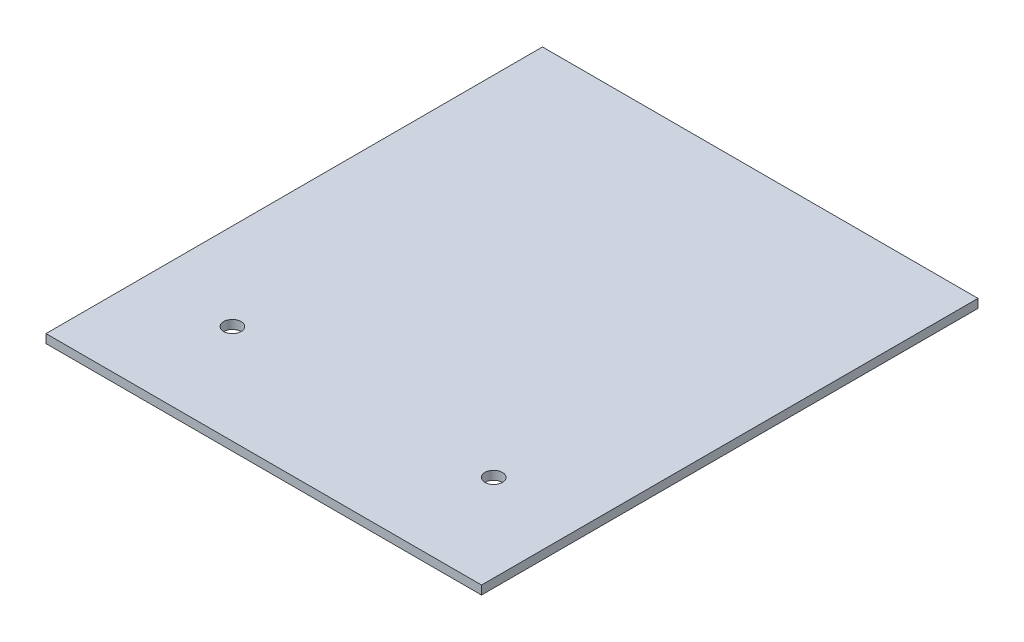
ISO-10303-21;
HEADER;
FILE_DESCRIPTION(('STEP AP214'),'2;1');
FILE_NAME('part.step','',(''),(''),'','','');
FILE_SCHEMA(('AUTOMOTIVE_DESIGN { 1 0 10303 214 1 1 1 1 }'));
ENDSEC;
DATA;
#1=APPLICATION_CONTEXT('core data for automotive mechanical design processes');
#2=APPLICATION_PROTOCOL_DEFINITION('international standard','automotive_design',2000,#1);
#3=PRODUCT_CONTEXT('',#1,'mechanical');
#4=PRODUCT('Part','Part','',(#3));
#5=PRODUCT_RELATED_PRODUCT_CATEGORY('part','',(#4));
#6=PRODUCT_DEFINITION_FORMATION('','',#4);
#7=PRODUCT_DEFINITION_CONTEXT('part definition',#1,'design');
#8=PRODUCT_DEFINITION('design','',#6,#7);
#9=PRODUCT_DEFINITION_SHAPE('','',#8);
#10=(LENGTH_UNIT() NAMED_UNIT(*) SI_UNIT(.MILLI.,.METRE.));
#11=(NAMED_UNIT(*) PLANE_ANGLE_UNIT() SI_UNIT($,.RADIAN.));
#12=(NAMED_UNIT(*) SI_UNIT($,.STERADIAN.) SOLID_ANGLE_UNIT());
#13=UNCERTAINTY_MEASURE_WITH_UNIT(LENGTH_MEASURE(1.E-05),#10,'distance_accuracy_value','');
#14=(GEOMETRIC_REPRESENTATION_CONTEXT(3) GLOBAL_UNCERTAINTY_ASSIGNED_CONTEXT((#13)) GLOBAL_UNIT_ASSIGNED_CONTEXT((#10,
#11,#12)) REPRESENTATION_CONTEXT('',''));
#15=CARTESIAN_POINT('',(0.,0.,0.));
#16=DIRECTION('',(0.,0.,1.));
#17=DIRECTION('',(1.,0.,0.));
#18=AXIS2_PLACEMENT_3D('',#15,#16,#17);
#19=CARTESIAN_POINT('',(0.,5.,0.));
#20=DIRECTION('',(0.,-1.,0.));
#21=DIRECTION('',(0.,0.,-1.));
#22=AXIS2_PLACEMENT_3D('',#19,#20,#21);
#23=PLANE('',#22);
#24=DIRECTION('',(0.,0.,-1.));
#25=VECTOR('',#24,1.);
#26=CARTESIAN_POINT('',(125.,5.,142.5));
#27=LINE('',#26,#25);
#28=CARTESIAN_POINT('',(125.,5.,142.5));
#29=VERTEX_POINT('',#28);
#30=CARTESIAN_POINT('',(125.,5.,-142.5));
#31=VERTEX_POINT('',#30);
#32=EDGE_CURVE('E85',#29,#31,#27,.T.);
#33=ORIENTED_EDGE('',*,*,#32,.T.);
#34=DIRECTION('',(-1.,0.,0.));
#35=VECTOR('',#34,1.);
#36=CARTESIAN_POINT('',(-125.,5.,-142.5));
#37=LINE('',#36,#35);
#38=CARTESIAN_POINT('',(-125.,5.,-142.5));
#39=VERTEX_POINT('',#38);
#40=EDGE_CURVE('E80',#31,#39,#37,.T.);
#41=ORIENTED_EDGE('',*,*,#40,.T.);
#42=DIRECTION('',(0.,0.,1.));
#43=VECTOR('',#42,1.);
#44=CARTESIAN_POINT('',(-125.,5.,142.5));
#45=LINE('',#44,#43);
#46=CARTESIAN_POINT('',(-125.,5.,142.5));
#47=VERTEX_POINT('',#46);
#48=EDGE_CURVE('E83',#39,#47,#45,.T.);
#49=ORIENTED_EDGE('',*,*,#48,.T.);
#50=DIRECTION('',(1.,0.,0.));
#51=VECTOR('',#50,1.);
#52=CARTESIAN_POINT('',(-125.,5.,142.5));
#53=LINE('',#52,#51);
#54=EDGE_CURVE('E50',#47,#29,#53,.T.);
#55=ORIENTED_EDGE('',*,*,#54,.T.);
#56=EDGE_LOOP('',(#33,#41,#49,#55));
#57=FACE_BOUND('',#56,.T.);
#58=CARTESIAN_POINT('',(-75.,5.,85.5));
#59=DIRECTION('',(0.,1.,0.));
#60=DIRECTION('',(0.,0.,1.));
#61=AXIS2_PLACEMENT_3D('',#58,#59,#60);
#62=CIRCLE('',#61,5.00000000000001);
#63=CARTESIAN_POINT('',(-75.,5.,90.5));
#64=VERTEX_POINT('',#63);
#65=EDGE_CURVE('E100',#64,#64,#62,.T.);
#66=ORIENTED_EDGE('',*,*,#65,.F.);
#67=EDGE_LOOP('',(#66));
#68=FACE_BOUND('',#67,.T.);
#69=CARTESIAN_POINT('',(75.,5.,85.5));
#70=DIRECTION('',(0.,1.,0.));
#71=DIRECTION('',(0.,0.,1.));
#72=AXIS2_PLACEMENT_3D('',#69,#70,#71);
#73=CIRCLE('',#72,5.00000000000001);
#74=CARTESIAN_POINT('',(75.,5.,90.5));
#75=VERTEX_POINT('',#74);
#76=EDGE_CURVE('E115',#75,#75,#73,.T.);
#77=ORIENTED_EDGE('',*,*,#76,.F.);
#78=EDGE_LOOP('',(#77));
#79=FACE_BOUND('',#78,.T.);
#80=ADVANCED_FACE('F33',(#57,#68,#79),#23,.F.);
#81=CARTESIAN_POINT('',(0.,0.,0.));
#82=DIRECTION('',(0.,-1.,0.));
#83=DIRECTION('',(0.,0.,-1.));
#84=AXIS2_PLACEMENT_3D('',#81,#82,#83);
#85=PLANE('',#84);
#86=CARTESIAN_POINT('',(-75.,0.,85.5));
#87=DIRECTION('',(0.,1.,0.));
#88=DIRECTION('',(0.,0.,1.));
#89=AXIS2_PLACEMENT_3D('',#86,#87,#88);
#90=CIRCLE('',#89,5.00000000000001);
#91=CARTESIAN_POINT('',(-75.,0.,90.5));
#92=VERTEX_POINT('',#91);
#93=EDGE_CURVE('E112',#92,#92,#90,.T.);
#94=ORIENTED_EDGE('',*,*,#93,.T.);
#95=EDGE_LOOP('',(#94));
#96=FACE_BOUND('',#95,.T.);
#97=DIRECTION('',(0.,0.,-1.));
#98=VECTOR('',#97,1.);
#99=CARTESIAN_POINT('',(125.,0.,142.5));
#100=LINE('',#99,#98);
#101=CARTESIAN_POINT('',(125.,0.,142.5));
#102=VERTEX_POINT('',#101);
#103=CARTESIAN_POINT('',(125.,0.,-142.5));
#104=VERTEX_POINT('',#103);
#105=EDGE_CURVE('E97',#102,#104,#100,.T.);
#106=ORIENTED_EDGE('',*,*,#105,.F.);
#107=DIRECTION('',(1.,0.,0.));
#108=VECTOR('',#107,1.);
#109=CARTESIAN_POINT('',(-125.,0.,142.5));
#110=LINE('',#109,#108);
#111=CARTESIAN_POINT('',(-125.,0.,142.5));
#112=VERTEX_POINT('',#111);
#113=EDGE_CURVE('E73',#112,#102,#110,.T.);
#114=ORIENTED_EDGE('',*,*,#113,.F.);
#115=DIRECTION('',(0.,0.,1.));
#116=VECTOR('',#115,1.);
#117=CARTESIAN_POINT('',(-125.,0.,142.5));
#118=LINE('',#117,#116);
#119=CARTESIAN_POINT('',(-125.,0.,-142.5));
#120=VERTEX_POINT('',#119);
#121=EDGE_CURVE('E67',#120,#112,#118,.T.);
#122=ORIENTED_EDGE('',*,*,#121,.F.);
#123=DIRECTION('',(-1.,0.,0.));
#124=VECTOR('',#123,1.);
#125=CARTESIAN_POINT('',(-125.,0.,-142.5));
#126=LINE('',#125,#124);
#127=EDGE_CURVE('E89',#104,#120,#126,.T.);
#128=ORIENTED_EDGE('',*,*,#127,.F.);
#129=EDGE_LOOP('',(#106,#114,#122,#128));
#130=FACE_BOUND('',#129,.T.);
#131=CARTESIAN_POINT('',(75.,0.,85.5));
#132=DIRECTION('',(0.,1.,0.));
#133=DIRECTION('',(0.,0.,1.));
#134=AXIS2_PLACEMENT_3D('',#131,#132,#133);
#135=CIRCLE('',#134,5.00000000000001);
#136=CARTESIAN_POINT('',(75.,0.,90.5));
#137=VERTEX_POINT('',#136);
#138=EDGE_CURVE('E118',#137,#137,#135,.T.);
#139=ORIENTED_EDGE('',*,*,#138,.T.);
#140=EDGE_LOOP('',(#139));
#141=FACE_BOUND('',#140,.T.);
#142=ADVANCED_FACE('F108',(#96,#130,#141),#85,.T.);
#143=CARTESIAN_POINT('',(125.,5.,142.5));
#144=DIRECTION('',(-1.,0.,0.));
#145=DIRECTION('',(0.,0.,1.));
#146=AXIS2_PLACEMENT_3D('',#143,#144,#145);
#147=PLANE('',#146);
#148=ORIENTED_EDGE('',*,*,#105,.T.);
#149=DIRECTION('',(0.,-1.,0.));
#150=VECTOR('',#149,1.);
#151=CARTESIAN_POINT('',(125.,5.,-142.5));
#152=LINE('',#151,#150);
#153=EDGE_CURVE('E11',#31,#104,#152,.T.);
#154=ORIENTED_EDGE('',*,*,#153,.F.);
#155=ORIENTED_EDGE('',*,*,#32,.F.);
#156=DIRECTION('',(0.,-1.,0.));
#157=VECTOR('',#156,1.);
#158=CARTESIAN_POINT('',(125.,5.,142.5));
#159=LINE('',#158,#157);
#160=EDGE_CURVE('E93',#29,#102,#159,.T.);
#161=ORIENTED_EDGE('',*,*,#160,.T.);
#162=EDGE_LOOP('',(#148,#154,#155,#161));
#163=FACE_BOUND('',#162,.T.);
#164=ADVANCED_FACE('F35',(#163),#147,.F.);
#165=CARTESIAN_POINT('',(-125.,5.,-142.5));
#166=DIRECTION('',(0.,0.,1.));
#167=DIRECTION('',(1.,0.,0.));
#168=AXIS2_PLACEMENT_3D('',#165,#166,#167);
#169=PLANE('',#168);
#170=ORIENTED_EDGE('',*,*,#127,.T.);
#171=DIRECTION('',(0.,-1.,0.));
#172=VECTOR('',#171,1.);
#173=CARTESIAN_POINT('',(-125.,5.,-142.5));
#174=LINE('',#173,#172);
#175=EDGE_CURVE('E42',#39,#120,#174,.T.);
#176=ORIENTED_EDGE('',*,*,#175,.F.);
#177=ORIENTED_EDGE('',*,*,#40,.F.);
#178=ORIENTED_EDGE('',*,*,#153,.T.);
#179=EDGE_LOOP('',(#170,#176,#177,#178));
#180=FACE_BOUND('',#179,.T.);
#181=ADVANCED_FACE('F88',(#180),#169,.F.);
#182=CARTESIAN_POINT('',(-125.,5.,142.5));
#183=DIRECTION('',(1.,0.,0.));
#184=DIRECTION('',(0.,0.,-1.));
#185=AXIS2_PLACEMENT_3D('',#182,#183,#184);
#186=PLANE('',#185);
#187=ORIENTED_EDGE('',*,*,#121,.T.);
#188=DIRECTION('',(0.,-1.,0.));
#189=VECTOR('',#188,1.);
#190=CARTESIAN_POINT('',(-125.,5.,142.5));
#191=LINE('',#190,#189);
#192=EDGE_CURVE('E90',#47,#112,#191,.T.);
#193=ORIENTED_EDGE('',*,*,#192,.F.);
#194=ORIENTED_EDGE('',*,*,#48,.F.);
#195=ORIENTED_EDGE('',*,*,#175,.T.);
#196=EDGE_LOOP('',(#187,#193,#194,#195));
#197=FACE_BOUND('',#196,.T.);
#198=ADVANCED_FACE('F91',(#197),#186,.F.);
#199=CARTESIAN_POINT('',(-125.,5.,142.5));
#200=DIRECTION('',(0.,0.,-1.));
#201=DIRECTION('',(-1.,0.,0.));
#202=AXIS2_PLACEMENT_3D('',#199,#200,#201);
#203=PLANE('',#202);
#204=ORIENTED_EDGE('',*,*,#113,.T.);
#205=ORIENTED_EDGE('',*,*,#160,.F.);
#206=ORIENTED_EDGE('',*,*,#54,.F.);
#207=ORIENTED_EDGE('',*,*,#192,.T.);
#208=EDGE_LOOP('',(#204,#205,#206,#207));
#209=FACE_BOUND('',#208,.T.);
#210=ADVANCED_FACE('F105',(#209),#203,.F.);
#211=CARTESIAN_POINT('',(-75.,5.,85.5));
#212=DIRECTION('',(0.,-1.,0.));
#213=DIRECTION('',(0.,0.,-1.));
#214=AXIS2_PLACEMENT_3D('',#211,#212,#213);
#215=CYLINDRICAL_SURFACE('',#214,5.00000000000001);
#216=ORIENTED_EDGE('',*,*,#65,.T.);
#217=EDGE_LOOP('',(#216));
#218=FACE_BOUND('',#217,.T.);
#219=ORIENTED_EDGE('',*,*,#93,.F.);
#220=EDGE_LOOP('',(#219));
#221=FACE_BOUND('',#220,.T.);
#222=ADVANCED_FACE('F135',(#218,#221),#215,.F.);
#223=CARTESIAN_POINT('',(75.,5.,85.5));
#224=DIRECTION('',(0.,-1.,0.));
#225=DIRECTION('',(0.,0.,-1.));
#226=AXIS2_PLACEMENT_3D('',#223,#224,#225);
#227=CYLINDRICAL_SURFACE('',#226,5.00000000000001);
#228=ORIENTED_EDGE('',*,*,#76,.T.);
#229=EDGE_LOOP('',(#228));
#230=FACE_BOUND('',#229,.T.);
#231=ORIENTED_EDGE('',*,*,#138,.F.);
#232=EDGE_LOOP('',(#231));
#233=FACE_BOUND('',#232,.T.);
#234=ADVANCED_FACE('F124',(#230,#233),#227,.F.);
#235=CLOSED_SHELL('',(#80,#142,#164,#181,#198,#210,#222,#234));
#236=MANIFOLD_SOLID_BREP('B2',#235);
#237=ADVANCED_BREP_SHAPE_REPRESENTATION('',(#18,#236),#14);
#238=SHAPE_DEFINITION_REPRESENTATION(#9,#237);
ENDSEC;
END-ISO-10303-21;
